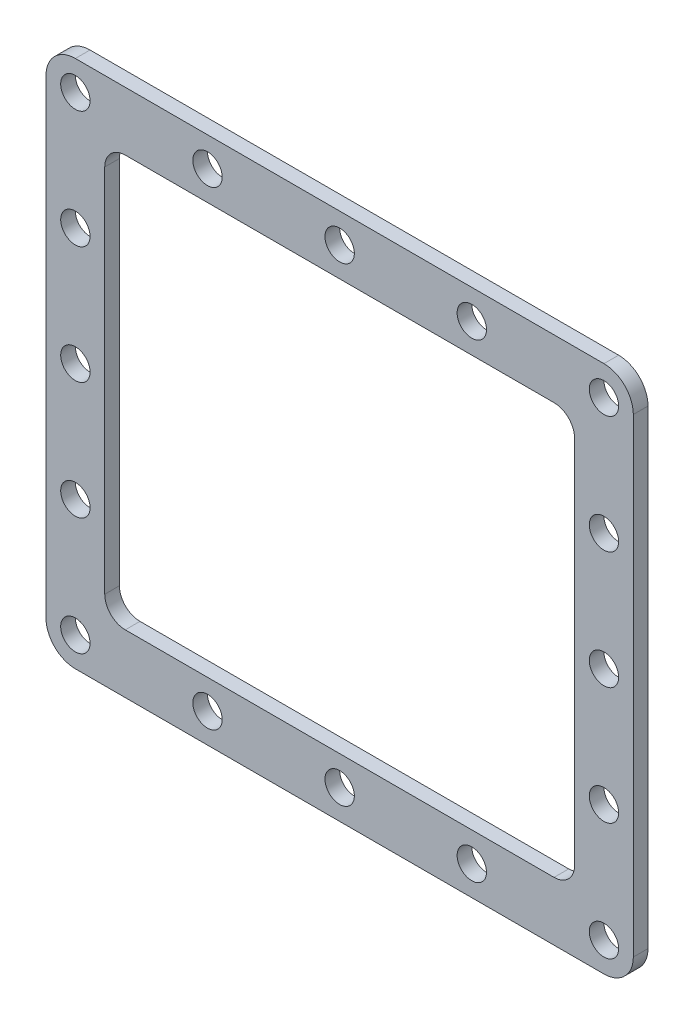
ISO-10303-21;
HEADER;
FILE_DESCRIPTION(('STEP AP214'),'2;1');
FILE_NAME('part.step','',(''),(''),'','','');
FILE_SCHEMA(('AUTOMOTIVE_DESIGN { 1 0 10303 214 1 1 1 1 }'));
ENDSEC;
DATA;
#1=APPLICATION_CONTEXT('core data for automotive mechanical design processes');
#2=APPLICATION_PROTOCOL_DEFINITION('international standard','automotive_design',2000,#1);
#3=PRODUCT_CONTEXT('',#1,'mechanical');
#4=PRODUCT('Part','Part','',(#3));
#5=PRODUCT_RELATED_PRODUCT_CATEGORY('part','',(#4));
#6=PRODUCT_DEFINITION_FORMATION('','',#4);
#7=PRODUCT_DEFINITION_CONTEXT('part definition',#1,'design');
#8=PRODUCT_DEFINITION('design','',#6,#7);
#9=PRODUCT_DEFINITION_SHAPE('','',#8);
#10=(LENGTH_UNIT() NAMED_UNIT(*) SI_UNIT(.MILLI.,.METRE.));
#11=(NAMED_UNIT(*) PLANE_ANGLE_UNIT() SI_UNIT($,.RADIAN.));
#12=(NAMED_UNIT(*) SI_UNIT($,.STERADIAN.) SOLID_ANGLE_UNIT());
#13=UNCERTAINTY_MEASURE_WITH_UNIT(LENGTH_MEASURE(1.E-05),#10,'distance_accuracy_value','');
#14=(GEOMETRIC_REPRESENTATION_CONTEXT(3) GLOBAL_UNCERTAINTY_ASSIGNED_CONTEXT((#13)) GLOBAL_UNIT_ASSIGNED_CONTEXT((#10,
#11,#12)) REPRESENTATION_CONTEXT('',''));
#15=CARTESIAN_POINT('',(0.,0.,0.));
#16=DIRECTION('',(0.,0.,1.));
#17=DIRECTION('',(1.,0.,0.));
#18=AXIS2_PLACEMENT_3D('',#15,#16,#17);
#19=CARTESIAN_POINT('',(90.,80.,5.));
#20=DIRECTION('',(0.,0.,-1.));
#21=DIRECTION('',(-1.,0.,0.));
#22=AXIS2_PLACEMENT_3D('',#19,#20,#21);
#23=PLANE('',#22);
#24=CARTESIAN_POINT('',(90.,80.,5.));
#25=DIRECTION('',(0.,0.,1.));
#26=DIRECTION('',(-1.,0.,0.));
#27=AXIS2_PLACEMENT_3D('',#24,#25,#26);
#28=CIRCLE('',#27,10.);
#29=CARTESIAN_POINT('',(100.,80.,5.));
#30=VERTEX_POINT('',#29);
#31=CARTESIAN_POINT('',(90.,90.,5.));
#32=VERTEX_POINT('',#31);
#33=EDGE_CURVE('E245',#30,#32,#28,.T.);
#34=ORIENTED_EDGE('',*,*,#33,.T.);
#35=DIRECTION('',(-1.,0.,0.));
#36=VECTOR('',#35,1.);
#37=CARTESIAN_POINT('',(-90.,90.,5.));
#38=LINE('',#37,#36);
#39=CARTESIAN_POINT('',(-90.,90.,5.));
#40=VERTEX_POINT('',#39);
#41=EDGE_CURVE('E249',#32,#40,#38,.T.);
#42=ORIENTED_EDGE('',*,*,#41,.T.);
#43=CARTESIAN_POINT('',(-90.,80.0000000000001,5.));
#44=DIRECTION('',(0.,0.,1.));
#45=DIRECTION('',(-1.,0.,0.));
#46=AXIS2_PLACEMENT_3D('',#43,#44,#45);
#47=CIRCLE('',#46,9.99999999999998);
#48=CARTESIAN_POINT('',(-99.9999999999999,80.0000000000001,5.));
#49=VERTEX_POINT('',#48);
#50=EDGE_CURVE('E253',#40,#49,#47,.T.);
#51=ORIENTED_EDGE('',*,*,#50,.T.);
#52=DIRECTION('',(0.,-1.,0.));
#53=VECTOR('',#52,1.);
#54=CARTESIAN_POINT('',(-100.,-80.,5.));
#55=LINE('',#54,#53);
#56=CARTESIAN_POINT('',(-100.,-80.,5.));
#57=VERTEX_POINT('',#56);
#58=EDGE_CURVE('E256',#49,#57,#55,.T.);
#59=ORIENTED_EDGE('',*,*,#58,.T.);
#60=CARTESIAN_POINT('',(-90.,-80.,5.));
#61=DIRECTION('',(0.,0.,1.));
#62=DIRECTION('',(-1.,0.,0.));
#63=AXIS2_PLACEMENT_3D('',#60,#61,#62);
#64=CIRCLE('',#63,9.99999999999998);
#65=CARTESIAN_POINT('',(-90.,-90.,5.));
#66=VERTEX_POINT('',#65);
#67=EDGE_CURVE('E259',#57,#66,#64,.T.);
#68=ORIENTED_EDGE('',*,*,#67,.T.);
#69=DIRECTION('',(1.,0.,0.));
#70=VECTOR('',#69,1.);
#71=CARTESIAN_POINT('',(-90.,-90.,5.));
#72=LINE('',#71,#70);
#73=CARTESIAN_POINT('',(90.,-90.,5.));
#74=VERTEX_POINT('',#73);
#75=EDGE_CURVE('E262',#66,#74,#72,.T.);
#76=ORIENTED_EDGE('',*,*,#75,.T.);
#77=CARTESIAN_POINT('',(90.,-80.,5.));
#78=DIRECTION('',(0.,0.,1.));
#79=DIRECTION('',(1.,0.,0.));
#80=AXIS2_PLACEMENT_3D('',#77,#78,#79);
#81=CIRCLE('',#80,9.99999999999999);
#82=CARTESIAN_POINT('',(100.,-80.,5.));
#83=VERTEX_POINT('',#82);
#84=EDGE_CURVE('E265',#74,#83,#81,.T.);
#85=ORIENTED_EDGE('',*,*,#84,.T.);
#86=DIRECTION('',(0.,1.,0.));
#87=VECTOR('',#86,1.);
#88=CARTESIAN_POINT('',(100.,-80.,5.));
#89=LINE('',#88,#87);
#90=EDGE_CURVE('E268',#83,#30,#89,.T.);
#91=ORIENTED_EDGE('',*,*,#90,.T.);
#92=EDGE_LOOP('',(#34,#42,#51,#59,#68,#76,#85,#91));
#93=FACE_BOUND('',#92,.T.);
#94=CARTESIAN_POINT('',(73.0000000000001,63.,5.));
#95=DIRECTION('',(0.,0.,1.));
#96=DIRECTION('',(-1.,0.,0.));
#97=AXIS2_PLACEMENT_3D('',#94,#95,#96);
#98=CIRCLE('',#97,7.00000000000001);
#99=CARTESIAN_POINT('',(80.0000000000001,63.,5.));
#100=VERTEX_POINT('',#99);
#101=CARTESIAN_POINT('',(73.0000000000001,70.,5.));
#102=VERTEX_POINT('',#101);
#103=EDGE_CURVE('E153',#100,#102,#98,.T.);
#104=ORIENTED_EDGE('',*,*,#103,.F.);
#105=DIRECTION('',(0.,1.,0.));
#106=VECTOR('',#105,1.);
#107=CARTESIAN_POINT('',(80.0000000000001,-63.,5.));
#108=LINE('',#107,#106);
#109=CARTESIAN_POINT('',(80.0000000000001,-63.,5.));
#110=VERTEX_POINT('',#109);
#111=EDGE_CURVE('E196',#110,#100,#108,.T.);
#112=ORIENTED_EDGE('',*,*,#111,.F.);
#113=CARTESIAN_POINT('',(73.0000000000001,-63.,5.));
#114=DIRECTION('',(0.,0.,1.));
#115=DIRECTION('',(1.,0.,0.));
#116=AXIS2_PLACEMENT_3D('',#113,#114,#115);
#117=CIRCLE('',#116,7.);
#118=CARTESIAN_POINT('',(73.0000000000001,-70.,5.));
#119=VERTEX_POINT('',#118);
#120=EDGE_CURVE('E193',#119,#110,#117,.T.);
#121=ORIENTED_EDGE('',*,*,#120,.F.);
#122=DIRECTION('',(1.,0.,0.));
#123=VECTOR('',#122,1.);
#124=CARTESIAN_POINT('',(-73.,-70.,5.));
#125=LINE('',#124,#123);
#126=CARTESIAN_POINT('',(-73.,-70.,5.));
#127=VERTEX_POINT('',#126);
#128=EDGE_CURVE('E190',#127,#119,#125,.T.);
#129=ORIENTED_EDGE('',*,*,#128,.F.);
#130=CARTESIAN_POINT('',(-73.,-63.,5.));
#131=DIRECTION('',(0.,0.,1.));
#132=DIRECTION('',(-1.,0.,0.));
#133=AXIS2_PLACEMENT_3D('',#130,#131,#132);
#134=CIRCLE('',#133,7.);
#135=CARTESIAN_POINT('',(-80.,-63.,5.));
#136=VERTEX_POINT('',#135);
#137=EDGE_CURVE('E187',#136,#127,#134,.T.);
#138=ORIENTED_EDGE('',*,*,#137,.F.);
#139=DIRECTION('',(0.,-1.,0.));
#140=VECTOR('',#139,1.);
#141=CARTESIAN_POINT('',(-80.,-63.,5.));
#142=LINE('',#141,#140);
#143=CARTESIAN_POINT('',(-80.,63.,5.));
#144=VERTEX_POINT('',#143);
#145=EDGE_CURVE('E181',#144,#136,#142,.T.);
#146=ORIENTED_EDGE('',*,*,#145,.F.);
#147=CARTESIAN_POINT('',(-73.,63.,5.));
#148=DIRECTION('',(0.,0.,1.));
#149=DIRECTION('',(-1.,0.,0.));
#150=AXIS2_PLACEMENT_3D('',#147,#148,#149);
#151=CIRCLE('',#150,7.00000000000001);
#152=CARTESIAN_POINT('',(-73.,70.,5.));
#153=VERTEX_POINT('',#152);
#154=EDGE_CURVE('E177',#153,#144,#151,.T.);
#155=ORIENTED_EDGE('',*,*,#154,.F.);
#156=DIRECTION('',(-1.,0.,0.));
#157=VECTOR('',#156,1.);
#158=CARTESIAN_POINT('',(-73.,70.,5.));
#159=LINE('',#158,#157);
#160=EDGE_CURVE('E162',#102,#153,#159,.T.);
#161=ORIENTED_EDGE('',*,*,#160,.F.);
#162=EDGE_LOOP('',(#104,#112,#121,#129,#138,#146,#155,#161));
#163=FACE_BOUND('',#162,.T.);
#164=CARTESIAN_POINT('',(90.,-80.,5.));
#165=DIRECTION('',(0.,0.,1.));
#166=DIRECTION('',(1.,0.,0.));
#167=AXIS2_PLACEMENT_3D('',#164,#165,#166);
#168=CIRCLE('',#167,5.00000000000001);
#169=CARTESIAN_POINT('',(95.,-80.,5.));
#170=VERTEX_POINT('',#169);
#171=EDGE_CURVE('E201',#170,#170,#168,.T.);
#172=ORIENTED_EDGE('',*,*,#171,.F.);
#173=EDGE_LOOP('',(#172));
#174=FACE_BOUND('',#173,.T.);
#175=CARTESIAN_POINT('',(90.,80.,5.));
#176=DIRECTION('',(0.,0.,1.));
#177=DIRECTION('',(1.,0.,0.));
#178=AXIS2_PLACEMENT_3D('',#175,#176,#177);
#179=CIRCLE('',#178,5.00000000000001);
#180=CARTESIAN_POINT('',(95.,80.,5.));
#181=VERTEX_POINT('',#180);
#182=EDGE_CURVE('E594',#181,#181,#179,.T.);
#183=ORIENTED_EDGE('',*,*,#182,.F.);
#184=EDGE_LOOP('',(#183));
#185=FACE_BOUND('',#184,.T.);
#186=CARTESIAN_POINT('',(-90.,80.0000000000001,5.));
#187=DIRECTION('',(0.,0.,1.));
#188=DIRECTION('',(1.,0.,0.));
#189=AXIS2_PLACEMENT_3D('',#186,#187,#188);
#190=CIRCLE('',#189,4.99999999999997);
#191=CARTESIAN_POINT('',(-85.,80.0000000000001,5.));
#192=VERTEX_POINT('',#191);
#193=EDGE_CURVE('E586',#192,#192,#190,.T.);
#194=ORIENTED_EDGE('',*,*,#193,.F.);
#195=EDGE_LOOP('',(#194));
#196=FACE_BOUND('',#195,.T.);
#197=CARTESIAN_POINT('',(-90.,-80.,5.));
#198=DIRECTION('',(0.,0.,1.));
#199=DIRECTION('',(1.,0.,0.));
#200=AXIS2_PLACEMENT_3D('',#197,#198,#199);
#201=CIRCLE('',#200,5.);
#202=CARTESIAN_POINT('',(-85.,-80.,5.));
#203=VERTEX_POINT('',#202);
#204=EDGE_CURVE('E578',#203,#203,#201,.T.);
#205=ORIENTED_EDGE('',*,*,#204,.F.);
#206=EDGE_LOOP('',(#205));
#207=FACE_BOUND('',#206,.T.);
#208=CARTESIAN_POINT('',(90.,0.,5.));
#209=DIRECTION('',(0.,0.,1.));
#210=DIRECTION('',(1.,0.,0.));
#211=AXIS2_PLACEMENT_3D('',#208,#209,#210);
#212=CIRCLE('',#211,5.00000000000002);
#213=CARTESIAN_POINT('',(95.0000000000001,0.,5.));
#214=VERTEX_POINT('',#213);
#215=EDGE_CURVE('E570',#214,#214,#212,.T.);
#216=ORIENTED_EDGE('',*,*,#215,.F.);
#217=EDGE_LOOP('',(#216));
#218=FACE_BOUND('',#217,.T.);
#219=CARTESIAN_POINT('',(90.,-40.,5.));
#220=DIRECTION('',(0.,0.,1.));
#221=DIRECTION('',(1.,0.,0.));
#222=AXIS2_PLACEMENT_3D('',#219,#220,#221);
#223=CIRCLE('',#222,5.);
#224=CARTESIAN_POINT('',(95.,-40.,5.));
#225=VERTEX_POINT('',#224);
#226=EDGE_CURVE('E562',#225,#225,#223,.T.);
#227=ORIENTED_EDGE('',*,*,#226,.F.);
#228=EDGE_LOOP('',(#227));
#229=FACE_BOUND('',#228,.T.);
#230=CARTESIAN_POINT('',(90.,40.,5.));
#231=DIRECTION('',(0.,0.,1.));
#232=DIRECTION('',(1.,0.,0.));
#233=AXIS2_PLACEMENT_3D('',#230,#231,#232);
#234=CIRCLE('',#233,4.99999999999999);
#235=CARTESIAN_POINT('',(95.,40.,5.));
#236=VERTEX_POINT('',#235);
#237=EDGE_CURVE('E554',#236,#236,#234,.T.);
#238=ORIENTED_EDGE('',*,*,#237,.F.);
#239=EDGE_LOOP('',(#238));
#240=FACE_BOUND('',#239,.T.);
#241=CARTESIAN_POINT('',(-89.9999999999999,-40.,5.));
#242=DIRECTION('',(0.,0.,1.));
#243=DIRECTION('',(-1.,0.,0.));
#244=AXIS2_PLACEMENT_3D('',#241,#242,#243);
#245=CIRCLE('',#244,4.9999999999999);
#246=CARTESIAN_POINT('',(-94.9999999999998,-40.,5.));
#247=VERTEX_POINT('',#246);
#248=EDGE_CURVE('E546',#247,#247,#245,.T.);
#249=ORIENTED_EDGE('',*,*,#248,.F.);
#250=EDGE_LOOP('',(#249));
#251=FACE_BOUND('',#250,.T.);
#252=CARTESIAN_POINT('',(-89.9999999999999,0.,5.));
#253=DIRECTION('',(0.,0.,1.));
#254=DIRECTION('',(-1.,0.,0.));
#255=AXIS2_PLACEMENT_3D('',#252,#253,#254);
#256=CIRCLE('',#255,4.99999999999988);
#257=CARTESIAN_POINT('',(-94.9999999999998,0.,5.));
#258=VERTEX_POINT('',#257);
#259=EDGE_CURVE('E538',#258,#258,#256,.T.);
#260=ORIENTED_EDGE('',*,*,#259,.F.);
#261=EDGE_LOOP('',(#260));
#262=FACE_BOUND('',#261,.T.);
#263=CARTESIAN_POINT('',(-89.9999999999999,40.,5.));
#264=DIRECTION('',(0.,0.,1.));
#265=DIRECTION('',(-1.,0.,0.));
#266=AXIS2_PLACEMENT_3D('',#263,#264,#265);
#267=CIRCLE('',#266,4.99999999999988);
#268=CARTESIAN_POINT('',(-94.9999999999998,40.,5.));
#269=VERTEX_POINT('',#268);
#270=EDGE_CURVE('E530',#269,#269,#267,.T.);
#271=ORIENTED_EDGE('',*,*,#270,.F.);
#272=EDGE_LOOP('',(#271));
#273=FACE_BOUND('',#272,.T.);
#274=CARTESIAN_POINT('',(0.,80.,5.));
#275=DIRECTION('',(0.,0.,1.));
#276=DIRECTION('',(1.,0.,0.));
#277=AXIS2_PLACEMENT_3D('',#274,#275,#276);
#278=CIRCLE('',#277,5.);
#279=CARTESIAN_POINT('',(5.00000000000003,80.,5.));
#280=VERTEX_POINT('',#279);
#281=EDGE_CURVE('E522',#280,#280,#278,.T.);
#282=ORIENTED_EDGE('',*,*,#281,.F.);
#283=EDGE_LOOP('',(#282));
#284=FACE_BOUND('',#283,.T.);
#285=CARTESIAN_POINT('',(-45.,80.,5.));
#286=DIRECTION('',(0.,0.,1.));
#287=DIRECTION('',(1.,0.,0.));
#288=AXIS2_PLACEMENT_3D('',#285,#286,#287);
#289=CIRCLE('',#288,4.99999999999999);
#290=CARTESIAN_POINT('',(-40.,80.,5.));
#291=VERTEX_POINT('',#290);
#292=EDGE_CURVE('E514',#291,#291,#289,.T.);
#293=ORIENTED_EDGE('',*,*,#292,.F.);
#294=EDGE_LOOP('',(#293));
#295=FACE_BOUND('',#294,.T.);
#296=CARTESIAN_POINT('',(45.,80.,5.));
#297=DIRECTION('',(0.,0.,1.));
#298=DIRECTION('',(1.,0.,0.));
#299=AXIS2_PLACEMENT_3D('',#296,#297,#298);
#300=CIRCLE('',#299,5.);
#301=CARTESIAN_POINT('',(50.,80.,5.));
#302=VERTEX_POINT('',#301);
#303=EDGE_CURVE('E506',#302,#302,#300,.T.);
#304=ORIENTED_EDGE('',*,*,#303,.F.);
#305=EDGE_LOOP('',(#304));
#306=FACE_BOUND('',#305,.T.);
#307=CARTESIAN_POINT('',(0.,-80.,5.));
#308=DIRECTION('',(0.,0.,1.));
#309=DIRECTION('',(1.,0.,0.));
#310=AXIS2_PLACEMENT_3D('',#307,#308,#309);
#311=CIRCLE('',#310,5.);
#312=CARTESIAN_POINT('',(5.00000000000003,-80.,5.));
#313=VERTEX_POINT('',#312);
#314=EDGE_CURVE('E498',#313,#313,#311,.T.);
#315=ORIENTED_EDGE('',*,*,#314,.F.);
#316=EDGE_LOOP('',(#315));
#317=FACE_BOUND('',#316,.T.);
#318=CARTESIAN_POINT('',(-45.,-80.,5.));
#319=DIRECTION('',(0.,0.,1.));
#320=DIRECTION('',(1.,0.,0.));
#321=AXIS2_PLACEMENT_3D('',#318,#319,#320);
#322=CIRCLE('',#321,4.99999999999999);
#323=CARTESIAN_POINT('',(-40.,-80.,5.));
#324=VERTEX_POINT('',#323);
#325=EDGE_CURVE('E490',#324,#324,#322,.T.);
#326=ORIENTED_EDGE('',*,*,#325,.F.);
#327=EDGE_LOOP('',(#326));
#328=FACE_BOUND('',#327,.T.);
#329=CARTESIAN_POINT('',(45.,-80.,5.));
#330=DIRECTION('',(0.,0.,1.));
#331=DIRECTION('',(1.,0.,0.));
#332=AXIS2_PLACEMENT_3D('',#329,#330,#331);
#333=CIRCLE('',#332,5.);
#334=CARTESIAN_POINT('',(50.,-80.,5.));
#335=VERTEX_POINT('',#334);
#336=EDGE_CURVE('E479',#335,#335,#333,.T.);
#337=ORIENTED_EDGE('',*,*,#336,.F.);
#338=EDGE_LOOP('',(#337));
#339=FACE_BOUND('',#338,.T.);
#340=ADVANCED_FACE('F39',(#93,#163,#174,#185,#196,#207,#218,#229,#240,#251,#262,#273,#284,#295,
#306,#317,#328,#339),#23,.F.);
#341=CARTESIAN_POINT('',(90.,80.,0.));
#342=DIRECTION('',(0.,0.,-1.));
#343=DIRECTION('',(-1.,0.,0.));
#344=AXIS2_PLACEMENT_3D('',#341,#342,#343);
#345=PLANE('',#344);
#346=CARTESIAN_POINT('',(-45.,-80.,0.));
#347=DIRECTION('',(0.,0.,1.));
#348=DIRECTION('',(1.,0.,0.));
#349=AXIS2_PLACEMENT_3D('',#346,#347,#348);
#350=CIRCLE('',#349,4.99999999999999);
#351=CARTESIAN_POINT('',(-40.,-80.,0.));
#352=VERTEX_POINT('',#351);
#353=EDGE_CURVE('E487',#352,#352,#350,.T.);
#354=ORIENTED_EDGE('',*,*,#353,.T.);
#355=EDGE_LOOP('',(#354));
#356=FACE_BOUND('',#355,.T.);
#357=CARTESIAN_POINT('',(45.,80.,0.));
#358=DIRECTION('',(0.,0.,1.));
#359=DIRECTION('',(1.,0.,0.));
#360=AXIS2_PLACEMENT_3D('',#357,#358,#359);
#361=CIRCLE('',#360,5.);
#362=CARTESIAN_POINT('',(50.,80.,0.));
#363=VERTEX_POINT('',#362);
#364=EDGE_CURVE('E502',#363,#363,#361,.T.);
#365=ORIENTED_EDGE('',*,*,#364,.T.);
#366=EDGE_LOOP('',(#365));
#367=FACE_BOUND('',#366,.T.);
#368=CARTESIAN_POINT('',(0.,80.,0.));
#369=DIRECTION('',(0.,0.,1.));
#370=DIRECTION('',(1.,0.,0.));
#371=AXIS2_PLACEMENT_3D('',#368,#369,#370);
#372=CIRCLE('',#371,5.);
#373=CARTESIAN_POINT('',(5.00000000000003,80.,0.));
#374=VERTEX_POINT('',#373);
#375=EDGE_CURVE('E518',#374,#374,#372,.T.);
#376=ORIENTED_EDGE('',*,*,#375,.T.);
#377=EDGE_LOOP('',(#376));
#378=FACE_BOUND('',#377,.T.);
#379=CARTESIAN_POINT('',(-89.9999999999999,0.,0.));
#380=DIRECTION('',(0.,0.,1.));
#381=DIRECTION('',(-1.,0.,0.));
#382=AXIS2_PLACEMENT_3D('',#379,#380,#381);
#383=CIRCLE('',#382,4.99999999999988);
#384=CARTESIAN_POINT('',(-94.9999999999998,0.,0.));
#385=VERTEX_POINT('',#384);
#386=EDGE_CURVE('E534',#385,#385,#383,.T.);
#387=ORIENTED_EDGE('',*,*,#386,.T.);
#388=EDGE_LOOP('',(#387));
#389=FACE_BOUND('',#388,.T.);
#390=CARTESIAN_POINT('',(90.,40.,0.));
#391=DIRECTION('',(0.,0.,1.));
#392=DIRECTION('',(1.,0.,0.));
#393=AXIS2_PLACEMENT_3D('',#390,#391,#392);
#394=CIRCLE('',#393,4.99999999999999);
#395=CARTESIAN_POINT('',(95.,40.,0.));
#396=VERTEX_POINT('',#395);
#397=EDGE_CURVE('E550',#396,#396,#394,.T.);
#398=ORIENTED_EDGE('',*,*,#397,.T.);
#399=EDGE_LOOP('',(#398));
#400=FACE_BOUND('',#399,.T.);
#401=CARTESIAN_POINT('',(90.,0.,0.));
#402=DIRECTION('',(0.,0.,1.));
#403=DIRECTION('',(1.,0.,0.));
#404=AXIS2_PLACEMENT_3D('',#401,#402,#403);
#405=CIRCLE('',#404,5.00000000000002);
#406=CARTESIAN_POINT('',(95.0000000000001,0.,0.));
#407=VERTEX_POINT('',#406);
#408=EDGE_CURVE('E566',#407,#407,#405,.T.);
#409=ORIENTED_EDGE('',*,*,#408,.T.);
#410=EDGE_LOOP('',(#409));
#411=FACE_BOUND('',#410,.T.);
#412=CARTESIAN_POINT('',(-90.,80.0000000000001,0.));
#413=DIRECTION('',(0.,0.,1.));
#414=DIRECTION('',(1.,0.,0.));
#415=AXIS2_PLACEMENT_3D('',#412,#413,#414);
#416=CIRCLE('',#415,4.99999999999997);
#417=CARTESIAN_POINT('',(-85.,80.0000000000001,0.));
#418=VERTEX_POINT('',#417);
#419=EDGE_CURVE('E582',#418,#418,#416,.T.);
#420=ORIENTED_EDGE('',*,*,#419,.T.);
#421=EDGE_LOOP('',(#420));
#422=FACE_BOUND('',#421,.T.);
#423=CARTESIAN_POINT('',(90.,-80.,0.));
#424=DIRECTION('',(0.,0.,1.));
#425=DIRECTION('',(1.,0.,0.));
#426=AXIS2_PLACEMENT_3D('',#423,#424,#425);
#427=CIRCLE('',#426,5.00000000000001);
#428=CARTESIAN_POINT('',(95.,-80.,0.));
#429=VERTEX_POINT('',#428);
#430=EDGE_CURVE('E598',#429,#429,#427,.T.);
#431=ORIENTED_EDGE('',*,*,#430,.T.);
#432=EDGE_LOOP('',(#431));
#433=FACE_BOUND('',#432,.T.);
#434=CARTESIAN_POINT('',(90.,80.,0.));
#435=DIRECTION('',(0.,0.,1.));
#436=DIRECTION('',(-1.,0.,0.));
#437=AXIS2_PLACEMENT_3D('',#434,#435,#436);
#438=CIRCLE('',#437,10.);
#439=CARTESIAN_POINT('',(100.,80.,0.));
#440=VERTEX_POINT('',#439);
#441=CARTESIAN_POINT('',(90.,90.,0.));
#442=VERTEX_POINT('',#441);
#443=EDGE_CURVE('E171',#440,#442,#438,.T.);
#444=ORIENTED_EDGE('',*,*,#443,.F.);
#445=DIRECTION('',(0.,1.,0.));
#446=VECTOR('',#445,1.);
#447=CARTESIAN_POINT('',(100.,-80.,0.));
#448=LINE('',#447,#446);
#449=CARTESIAN_POINT('',(100.,-80.,0.));
#450=VERTEX_POINT('',#449);
#451=EDGE_CURVE('E250',#450,#440,#448,.T.);
#452=ORIENTED_EDGE('',*,*,#451,.F.);
#453=CARTESIAN_POINT('',(90.,-80.,0.));
#454=DIRECTION('',(0.,0.,1.));
#455=DIRECTION('',(1.,0.,0.));
#456=AXIS2_PLACEMENT_3D('',#453,#454,#455);
#457=CIRCLE('',#456,9.99999999999999);
#458=CARTESIAN_POINT('',(90.,-90.,0.));
#459=VERTEX_POINT('',#458);
#460=EDGE_CURVE('E290',#459,#450,#457,.T.);
#461=ORIENTED_EDGE('',*,*,#460,.F.);
#462=DIRECTION('',(1.,0.,0.));
#463=VECTOR('',#462,1.);
#464=CARTESIAN_POINT('',(-90.,-90.,0.));
#465=LINE('',#464,#463);
#466=CARTESIAN_POINT('',(-90.,-90.,0.));
#467=VERTEX_POINT('',#466);
#468=EDGE_CURVE('E287',#467,#459,#465,.T.);
#469=ORIENTED_EDGE('',*,*,#468,.F.);
#470=CARTESIAN_POINT('',(-90.,-80.,0.));
#471=DIRECTION('',(0.,0.,1.));
#472=DIRECTION('',(-1.,0.,0.));
#473=AXIS2_PLACEMENT_3D('',#470,#471,#472);
#474=CIRCLE('',#473,9.99999999999998);
#475=CARTESIAN_POINT('',(-100.,-80.,0.));
#476=VERTEX_POINT('',#475);
#477=EDGE_CURVE('E284',#476,#467,#474,.T.);
#478=ORIENTED_EDGE('',*,*,#477,.F.);
#479=DIRECTION('',(0.,-1.,0.));
#480=VECTOR('',#479,1.);
#481=CARTESIAN_POINT('',(-100.,-80.,0.));
#482=LINE('',#481,#480);
#483=CARTESIAN_POINT('',(-99.9999999999999,80.0000000000001,0.));
#484=VERTEX_POINT('',#483);
#485=EDGE_CURVE('E281',#484,#476,#482,.T.);
#486=ORIENTED_EDGE('',*,*,#485,.F.);
#487=CARTESIAN_POINT('',(-90.,80.0000000000001,0.));
#488=DIRECTION('',(0.,0.,1.));
#489=DIRECTION('',(-1.,0.,0.));
#490=AXIS2_PLACEMENT_3D('',#487,#488,#489);
#491=CIRCLE('',#490,9.99999999999998);
#492=CARTESIAN_POINT('',(-90.,90.,0.));
#493=VERTEX_POINT('',#492);
#494=EDGE_CURVE('E278',#493,#484,#491,.T.);
#495=ORIENTED_EDGE('',*,*,#494,.F.);
#496=DIRECTION('',(-1.,0.,0.));
#497=VECTOR('',#496,1.);
#498=CARTESIAN_POINT('',(-90.,90.,0.));
#499=LINE('',#498,#497);
#500=EDGE_CURVE('E275',#442,#493,#499,.T.);
#501=ORIENTED_EDGE('',*,*,#500,.F.);
#502=EDGE_LOOP('',(#444,#452,#461,#469,#478,#486,#495,#501));
#503=FACE_BOUND('',#502,.T.);
#504=DIRECTION('',(0.,1.,0.));
#505=VECTOR('',#504,1.);
#506=CARTESIAN_POINT('',(80.0000000000001,-63.,0.));
#507=LINE('',#506,#505);
#508=CARTESIAN_POINT('',(80.0000000000001,-63.,0.));
#509=VERTEX_POINT('',#508);
#510=CARTESIAN_POINT('',(80.0000000000001,63.,0.));
#511=VERTEX_POINT('',#510);
#512=EDGE_CURVE('E163',#509,#511,#507,.T.);
#513=ORIENTED_EDGE('',*,*,#512,.T.);
#514=CARTESIAN_POINT('',(73.0000000000001,63.,0.));
#515=DIRECTION('',(0.,0.,1.));
#516=DIRECTION('',(-1.,0.,0.));
#517=AXIS2_PLACEMENT_3D('',#514,#515,#516);
#518=CIRCLE('',#517,7.00000000000001);
#519=CARTESIAN_POINT('',(73.0000000000001,70.,0.));
#520=VERTEX_POINT('',#519);
#521=EDGE_CURVE('E63',#511,#520,#518,.T.);
#522=ORIENTED_EDGE('',*,*,#521,.T.);
#523=DIRECTION('',(-1.,0.,0.));
#524=VECTOR('',#523,1.);
#525=CARTESIAN_POINT('',(-73.,70.,0.));
#526=LINE('',#525,#524);
#527=CARTESIAN_POINT('',(-73.,70.,0.));
#528=VERTEX_POINT('',#527);
#529=EDGE_CURVE('E169',#520,#528,#526,.T.);
#530=ORIENTED_EDGE('',*,*,#529,.T.);
#531=CARTESIAN_POINT('',(-73.,63.,0.));
#532=DIRECTION('',(0.,0.,1.));
#533=DIRECTION('',(-1.,0.,0.));
#534=AXIS2_PLACEMENT_3D('',#531,#532,#533);
#535=CIRCLE('',#534,7.00000000000001);
#536=CARTESIAN_POINT('',(-80.,63.,0.));
#537=VERTEX_POINT('',#536);
#538=EDGE_CURVE('E204',#528,#537,#535,.T.);
#539=ORIENTED_EDGE('',*,*,#538,.T.);
#540=DIRECTION('',(0.,-1.,0.));
#541=VECTOR('',#540,1.);
#542=CARTESIAN_POINT('',(-80.,-63.,0.));
#543=LINE('',#542,#541);
#544=CARTESIAN_POINT('',(-80.,-63.,0.));
#545=VERTEX_POINT('',#544);
#546=EDGE_CURVE('E208',#537,#545,#543,.T.);
#547=ORIENTED_EDGE('',*,*,#546,.T.);
#548=CARTESIAN_POINT('',(-73.,-63.,0.));
#549=DIRECTION('',(0.,0.,1.));
#550=DIRECTION('',(-1.,0.,0.));
#551=AXIS2_PLACEMENT_3D('',#548,#549,#550);
#552=CIRCLE('',#551,7.);
#553=CARTESIAN_POINT('',(-73.,-70.,0.));
#554=VERTEX_POINT('',#553);
#555=EDGE_CURVE('E212',#545,#554,#552,.T.);
#556=ORIENTED_EDGE('',*,*,#555,.T.);
#557=DIRECTION('',(1.,0.,0.));
#558=VECTOR('',#557,1.);
#559=CARTESIAN_POINT('',(-73.,-70.,0.));
#560=LINE('',#559,#558);
#561=CARTESIAN_POINT('',(73.0000000000001,-70.,0.));
#562=VERTEX_POINT('',#561);
#563=EDGE_CURVE('E216',#554,#562,#560,.T.);
#564=ORIENTED_EDGE('',*,*,#563,.T.);
#565=CARTESIAN_POINT('',(73.0000000000001,-63.,0.));
#566=DIRECTION('',(0.,0.,1.));
#567=DIRECTION('',(1.,0.,0.));
#568=AXIS2_PLACEMENT_3D('',#565,#566,#567);
#569=CIRCLE('',#568,7.);
#570=EDGE_CURVE('E220',#562,#509,#569,.T.);
#571=ORIENTED_EDGE('',*,*,#570,.T.);
#572=EDGE_LOOP('',(#513,#522,#530,#539,#547,#556,#564,#571));
#573=FACE_BOUND('',#572,.T.);
#574=CARTESIAN_POINT('',(90.,80.,0.));
#575=DIRECTION('',(0.,0.,1.));
#576=DIRECTION('',(1.,0.,0.));
#577=AXIS2_PLACEMENT_3D('',#574,#575,#576);
#578=CIRCLE('',#577,5.00000000000001);
#579=CARTESIAN_POINT('',(95.,80.,0.));
#580=VERTEX_POINT('',#579);
#581=EDGE_CURVE('E590',#580,#580,#578,.T.);
#582=ORIENTED_EDGE('',*,*,#581,.T.);
#583=EDGE_LOOP('',(#582));
#584=FACE_BOUND('',#583,.T.);
#585=CARTESIAN_POINT('',(-90.,-80.,0.));
#586=DIRECTION('',(0.,0.,1.));
#587=DIRECTION('',(1.,0.,0.));
#588=AXIS2_PLACEMENT_3D('',#585,#586,#587);
#589=CIRCLE('',#588,5.);
#590=CARTESIAN_POINT('',(-85.,-80.,0.));
#591=VERTEX_POINT('',#590);
#592=EDGE_CURVE('E574',#591,#591,#589,.T.);
#593=ORIENTED_EDGE('',*,*,#592,.T.);
#594=EDGE_LOOP('',(#593));
#595=FACE_BOUND('',#594,.T.);
#596=CARTESIAN_POINT('',(90.,-40.,0.));
#597=DIRECTION('',(0.,0.,1.));
#598=DIRECTION('',(1.,0.,0.));
#599=AXIS2_PLACEMENT_3D('',#596,#597,#598);
#600=CIRCLE('',#599,5.);
#601=CARTESIAN_POINT('',(95.,-40.,0.));
#602=VERTEX_POINT('',#601);
#603=EDGE_CURVE('E558',#602,#602,#600,.T.);
#604=ORIENTED_EDGE('',*,*,#603,.T.);
#605=EDGE_LOOP('',(#604));
#606=FACE_BOUND('',#605,.T.);
#607=CARTESIAN_POINT('',(-89.9999999999999,-40.,0.));
#608=DIRECTION('',(0.,0.,1.));
#609=DIRECTION('',(-1.,0.,0.));
#610=AXIS2_PLACEMENT_3D('',#607,#608,#609);
#611=CIRCLE('',#610,4.9999999999999);
#612=CARTESIAN_POINT('',(-94.9999999999998,-40.,0.));
#613=VERTEX_POINT('',#612);
#614=EDGE_CURVE('E542',#613,#613,#611,.T.);
#615=ORIENTED_EDGE('',*,*,#614,.T.);
#616=EDGE_LOOP('',(#615));
#617=FACE_BOUND('',#616,.T.);
#618=CARTESIAN_POINT('',(-89.9999999999999,40.,0.));
#619=DIRECTION('',(0.,0.,1.));
#620=DIRECTION('',(-1.,0.,0.));
#621=AXIS2_PLACEMENT_3D('',#618,#619,#620);
#622=CIRCLE('',#621,4.99999999999988);
#623=CARTESIAN_POINT('',(-94.9999999999998,40.,0.));
#624=VERTEX_POINT('',#623);
#625=EDGE_CURVE('E526',#624,#624,#622,.T.);
#626=ORIENTED_EDGE('',*,*,#625,.T.);
#627=EDGE_LOOP('',(#626));
#628=FACE_BOUND('',#627,.T.);
#629=CARTESIAN_POINT('',(-45.,80.,0.));
#630=DIRECTION('',(0.,0.,1.));
#631=DIRECTION('',(1.,0.,0.));
#632=AXIS2_PLACEMENT_3D('',#629,#630,#631);
#633=CIRCLE('',#632,4.99999999999999);
#634=CARTESIAN_POINT('',(-40.,80.,0.));
#635=VERTEX_POINT('',#634);
#636=EDGE_CURVE('E510',#635,#635,#633,.T.);
#637=ORIENTED_EDGE('',*,*,#636,.T.);
#638=EDGE_LOOP('',(#637));
#639=FACE_BOUND('',#638,.T.);
#640=CARTESIAN_POINT('',(0.,-80.,0.));
#641=DIRECTION('',(0.,0.,1.));
#642=DIRECTION('',(1.,0.,0.));
#643=AXIS2_PLACEMENT_3D('',#640,#641,#642);
#644=CIRCLE('',#643,5.);
#645=CARTESIAN_POINT('',(5.00000000000003,-80.,0.));
#646=VERTEX_POINT('',#645);
#647=EDGE_CURVE('E494',#646,#646,#644,.T.);
#648=ORIENTED_EDGE('',*,*,#647,.T.);
#649=EDGE_LOOP('',(#648));
#650=FACE_BOUND('',#649,.T.);
#651=CARTESIAN_POINT('',(45.,-80.,0.));
#652=DIRECTION('',(0.,0.,1.));
#653=DIRECTION('',(1.,0.,0.));
#654=AXIS2_PLACEMENT_3D('',#651,#652,#653);
#655=CIRCLE('',#654,5.);
#656=CARTESIAN_POINT('',(50.,-80.,0.));
#657=VERTEX_POINT('',#656);
#658=EDGE_CURVE('E482',#657,#657,#655,.T.);
#659=ORIENTED_EDGE('',*,*,#658,.T.);
#660=EDGE_LOOP('',(#659));
#661=FACE_BOUND('',#660,.T.);
#662=ADVANCED_FACE('F329',(#356,#367,#378,#389,#400,#411,#422,#433,#503,#573,#584,#595,#606,
#617,#628,#639,#650,#661),#345,.T.);
#663=CARTESIAN_POINT('',(90.,80.,5.));
#664=DIRECTION('',(0.,0.,-1.));
#665=DIRECTION('',(-1.,0.,0.));
#666=AXIS2_PLACEMENT_3D('',#663,#664,#665);
#667=CYLINDRICAL_SURFACE('',#666,10.);
#668=ORIENTED_EDGE('',*,*,#443,.T.);
#669=DIRECTION('',(0.,0.,-1.));
#670=VECTOR('',#669,1.);
#671=CARTESIAN_POINT('',(90.,90.,5.));
#672=LINE('',#671,#670);
#673=EDGE_CURVE('E11',#32,#442,#672,.T.);
#674=ORIENTED_EDGE('',*,*,#673,.F.);
#675=ORIENTED_EDGE('',*,*,#33,.F.);
#676=DIRECTION('',(0.,0.,-1.));
#677=VECTOR('',#676,1.);
#678=CARTESIAN_POINT('',(100.,80.,5.));
#679=LINE('',#678,#677);
#680=EDGE_CURVE('E271',#30,#440,#679,.T.);
#681=ORIENTED_EDGE('',*,*,#680,.T.);
#682=EDGE_LOOP('',(#668,#674,#675,#681));
#683=FACE_BOUND('',#682,.T.);
#684=ADVANCED_FACE('F41',(#683),#667,.T.);
#685=CARTESIAN_POINT('',(-90.,90.,5.));
#686=DIRECTION('',(0.,-1.,0.));
#687=DIRECTION('',(0.,0.,-1.));
#688=AXIS2_PLACEMENT_3D('',#685,#686,#687);
#689=PLANE('',#688);
#690=ORIENTED_EDGE('',*,*,#500,.T.);
#691=DIRECTION('',(0.,0.,-1.));
#692=VECTOR('',#691,1.);
#693=CARTESIAN_POINT('',(-90.,90.,5.));
#694=LINE('',#693,#692);
#695=EDGE_CURVE('E48',#40,#493,#694,.T.);
#696=ORIENTED_EDGE('',*,*,#695,.F.);
#697=ORIENTED_EDGE('',*,*,#41,.F.);
#698=ORIENTED_EDGE('',*,*,#673,.T.);
#699=EDGE_LOOP('',(#690,#696,#697,#698));
#700=FACE_BOUND('',#699,.T.);
#701=ADVANCED_FACE('F346',(#700),#689,.F.);
#702=CARTESIAN_POINT('',(-90.,80.0000000000001,5.));
#703=DIRECTION('',(0.,0.,-1.));
#704=DIRECTION('',(-1.,0.,0.));
#705=AXIS2_PLACEMENT_3D('',#702,#703,#704);
#706=CYLINDRICAL_SURFACE('',#705,9.99999999999998);
#707=ORIENTED_EDGE('',*,*,#494,.T.);
#708=DIRECTION('',(0.,0.,-1.));
#709=VECTOR('',#708,1.);
#710=CARTESIAN_POINT('',(-99.9999999999999,80.0000000000001,5.));
#711=LINE('',#710,#709);
#712=EDGE_CURVE('E314',#49,#484,#711,.T.);
#713=ORIENTED_EDGE('',*,*,#712,.F.);
#714=ORIENTED_EDGE('',*,*,#50,.F.);
#715=ORIENTED_EDGE('',*,*,#695,.T.);
#716=EDGE_LOOP('',(#707,#713,#714,#715));
#717=FACE_BOUND('',#716,.T.);
#718=ADVANCED_FACE('F323',(#717),#706,.T.);
#719=CARTESIAN_POINT('',(-100.,-80.,5.));
#720=DIRECTION('',(1.,0.,0.));
#721=DIRECTION('',(0.,0.,-1.));
#722=AXIS2_PLACEMENT_3D('',#719,#720,#721);
#723=PLANE('',#722);
#724=ORIENTED_EDGE('',*,*,#485,.T.);
#725=DIRECTION('',(0.,0.,-1.));
#726=VECTOR('',#725,1.);
#727=CARTESIAN_POINT('',(-100.,-80.,5.));
#728=LINE('',#727,#726);
#729=EDGE_CURVE('E310',#57,#476,#728,.T.);
#730=ORIENTED_EDGE('',*,*,#729,.F.);
#731=ORIENTED_EDGE('',*,*,#58,.F.);
#732=ORIENTED_EDGE('',*,*,#712,.T.);
#733=EDGE_LOOP('',(#724,#730,#731,#732));
#734=FACE_BOUND('',#733,.T.);
#735=ADVANCED_FACE('F335',(#734),#723,.F.);
#736=CARTESIAN_POINT('',(-90.,-80.,5.));
#737=DIRECTION('',(0.,0.,-1.));
#738=DIRECTION('',(-1.,0.,0.));
#739=AXIS2_PLACEMENT_3D('',#736,#737,#738);
#740=CYLINDRICAL_SURFACE('',#739,9.99999999999998);
#741=ORIENTED_EDGE('',*,*,#477,.T.);
#742=DIRECTION('',(0.,0.,-1.));
#743=VECTOR('',#742,1.);
#744=CARTESIAN_POINT('',(-90.,-90.,5.));
#745=LINE('',#744,#743);
#746=EDGE_CURVE('E306',#66,#467,#745,.T.);
#747=ORIENTED_EDGE('',*,*,#746,.F.);
#748=ORIENTED_EDGE('',*,*,#67,.F.);
#749=ORIENTED_EDGE('',*,*,#729,.T.);
#750=EDGE_LOOP('',(#741,#747,#748,#749));
#751=FACE_BOUND('',#750,.T.);
#752=ADVANCED_FACE('F339',(#751),#740,.T.);
#753=CARTESIAN_POINT('',(-90.,-90.,5.));
#754=DIRECTION('',(0.,1.,0.));
#755=DIRECTION('',(0.,0.,1.));
#756=AXIS2_PLACEMENT_3D('',#753,#754,#755);
#757=PLANE('',#756);
#758=ORIENTED_EDGE('',*,*,#468,.T.);
#759=DIRECTION('',(0.,0.,-1.));
#760=VECTOR('',#759,1.);
#761=CARTESIAN_POINT('',(90.,-90.,5.));
#762=LINE('',#761,#760);
#763=EDGE_CURVE('E302',#74,#459,#762,.T.);
#764=ORIENTED_EDGE('',*,*,#763,.F.);
#765=ORIENTED_EDGE('',*,*,#75,.F.);
#766=ORIENTED_EDGE('',*,*,#746,.T.);
#767=EDGE_LOOP('',(#758,#764,#765,#766));
#768=FACE_BOUND('',#767,.T.);
#769=ADVANCED_FACE('F359',(#768),#757,.F.);
#770=CARTESIAN_POINT('',(90.,-80.,5.));
#771=DIRECTION('',(0.,0.,-1.));
#772=DIRECTION('',(-1.,0.,0.));
#773=AXIS2_PLACEMENT_3D('',#770,#771,#772);
#774=CYLINDRICAL_SURFACE('',#773,9.99999999999999);
#775=ORIENTED_EDGE('',*,*,#460,.T.);
#776=DIRECTION('',(0.,0.,-1.));
#777=VECTOR('',#776,1.);
#778=CARTESIAN_POINT('',(100.,-80.,5.));
#779=LINE('',#778,#777);
#780=EDGE_CURVE('E298',#83,#450,#779,.T.);
#781=ORIENTED_EDGE('',*,*,#780,.F.);
#782=ORIENTED_EDGE('',*,*,#84,.F.);
#783=ORIENTED_EDGE('',*,*,#763,.T.);
#784=EDGE_LOOP('',(#775,#781,#782,#783));
#785=FACE_BOUND('',#784,.T.);
#786=ADVANCED_FACE('F357',(#785),#774,.T.);
#787=CARTESIAN_POINT('',(100.,-80.,5.));
#788=DIRECTION('',(-1.,0.,0.));
#789=DIRECTION('',(0.,0.,1.));
#790=AXIS2_PLACEMENT_3D('',#787,#788,#789);
#791=PLANE('',#790);
#792=ORIENTED_EDGE('',*,*,#451,.T.);
#793=ORIENTED_EDGE('',*,*,#680,.F.);
#794=ORIENTED_EDGE('',*,*,#90,.F.);
#795=ORIENTED_EDGE('',*,*,#780,.T.);
#796=EDGE_LOOP('',(#792,#793,#794,#795));
#797=FACE_BOUND('',#796,.T.);
#798=ADVANCED_FACE('F352',(#797),#791,.F.);
#799=CARTESIAN_POINT('',(73.0000000000001,63.,5.));
#800=DIRECTION('',(0.,0.,-1.));
#801=DIRECTION('',(-1.,0.,0.));
#802=AXIS2_PLACEMENT_3D('',#799,#800,#801);
#803=CYLINDRICAL_SURFACE('',#802,7.00000000000001);
#804=ORIENTED_EDGE('',*,*,#521,.F.);
#805=DIRECTION('',(0.,0.,-1.));
#806=VECTOR('',#805,1.);
#807=CARTESIAN_POINT('',(80.0000000000001,63.,5.));
#808=LINE('',#807,#806);
#809=EDGE_CURVE('E157',#100,#511,#808,.T.);
#810=ORIENTED_EDGE('',*,*,#809,.F.);
#811=ORIENTED_EDGE('',*,*,#103,.T.);
#812=DIRECTION('',(0.,0.,-1.));
#813=VECTOR('',#812,1.);
#814=CARTESIAN_POINT('',(73.0000000000001,70.,5.));
#815=LINE('',#814,#813);
#816=EDGE_CURVE('E156',#102,#520,#815,.T.);
#817=ORIENTED_EDGE('',*,*,#816,.T.);
#818=EDGE_LOOP('',(#804,#810,#811,#817));
#819=FACE_BOUND('',#818,.T.);
#820=ADVANCED_FACE('F155',(#819),#803,.F.);
#821=CARTESIAN_POINT('',(-73.,70.,5.));
#822=DIRECTION('',(0.,-1.,0.));
#823=DIRECTION('',(0.,0.,-1.));
#824=AXIS2_PLACEMENT_3D('',#821,#822,#823);
#825=PLANE('',#824);
#826=ORIENTED_EDGE('',*,*,#529,.F.);
#827=ORIENTED_EDGE('',*,*,#816,.F.);
#828=ORIENTED_EDGE('',*,*,#160,.T.);
#829=DIRECTION('',(0.,0.,-1.));
#830=VECTOR('',#829,1.);
#831=CARTESIAN_POINT('',(-73.,70.,5.));
#832=LINE('',#831,#830);
#833=EDGE_CURVE('E172',#153,#528,#832,.T.);
#834=ORIENTED_EDGE('',*,*,#833,.T.);
#835=EDGE_LOOP('',(#826,#827,#828,#834));
#836=FACE_BOUND('',#835,.T.);
#837=ADVANCED_FACE('F166',(#836),#825,.T.);
#838=CARTESIAN_POINT('',(-73.,63.,5.));
#839=DIRECTION('',(0.,0.,-1.));
#840=DIRECTION('',(-1.,0.,0.));
#841=AXIS2_PLACEMENT_3D('',#838,#839,#840);
#842=CYLINDRICAL_SURFACE('',#841,7.00000000000001);
#843=ORIENTED_EDGE('',*,*,#538,.F.);
#844=ORIENTED_EDGE('',*,*,#833,.F.);
#845=ORIENTED_EDGE('',*,*,#154,.T.);
#846=DIRECTION('',(0.,0.,-1.));
#847=VECTOR('',#846,1.);
#848=CARTESIAN_POINT('',(-80.,63.,5.));
#849=LINE('',#848,#847);
#850=EDGE_CURVE('E240',#144,#537,#849,.T.);
#851=ORIENTED_EDGE('',*,*,#850,.T.);
#852=EDGE_LOOP('',(#843,#844,#845,#851));
#853=FACE_BOUND('',#852,.T.);
#854=ADVANCED_FACE('F385',(#853),#842,.F.);
#855=CARTESIAN_POINT('',(-80.,-63.,5.));
#856=DIRECTION('',(1.,0.,0.));
#857=DIRECTION('',(0.,0.,-1.));
#858=AXIS2_PLACEMENT_3D('',#855,#856,#857);
#859=PLANE('',#858);
#860=ORIENTED_EDGE('',*,*,#546,.F.);
#861=ORIENTED_EDGE('',*,*,#850,.F.);
#862=ORIENTED_EDGE('',*,*,#145,.T.);
#863=DIRECTION('',(0.,0.,-1.));
#864=VECTOR('',#863,1.);
#865=CARTESIAN_POINT('',(-80.,-63.,5.));
#866=LINE('',#865,#864);
#867=EDGE_CURVE('E237',#136,#545,#866,.T.);
#868=ORIENTED_EDGE('',*,*,#867,.T.);
#869=EDGE_LOOP('',(#860,#861,#862,#868));
#870=FACE_BOUND('',#869,.T.);
#871=ADVANCED_FACE('F389',(#870),#859,.T.);
#872=CARTESIAN_POINT('',(-73.,-63.,5.));
#873=DIRECTION('',(0.,0.,-1.));
#874=DIRECTION('',(-1.,0.,0.));
#875=AXIS2_PLACEMENT_3D('',#872,#873,#874);
#876=CYLINDRICAL_SURFACE('',#875,7.);
#877=ORIENTED_EDGE('',*,*,#555,.F.);
#878=ORIENTED_EDGE('',*,*,#867,.F.);
#879=ORIENTED_EDGE('',*,*,#137,.T.);
#880=DIRECTION('',(0.,0.,-1.));
#881=VECTOR('',#880,1.);
#882=CARTESIAN_POINT('',(-73.,-70.,5.));
#883=LINE('',#882,#881);
#884=EDGE_CURVE('E234',#127,#554,#883,.T.);
#885=ORIENTED_EDGE('',*,*,#884,.T.);
#886=EDGE_LOOP('',(#877,#878,#879,#885));
#887=FACE_BOUND('',#886,.T.);
#888=ADVANCED_FACE('F395',(#887),#876,.F.);
#889=CARTESIAN_POINT('',(-73.,-70.,5.));
#890=DIRECTION('',(0.,1.,0.));
#891=DIRECTION('',(0.,0.,1.));
#892=AXIS2_PLACEMENT_3D('',#889,#890,#891);
#893=PLANE('',#892);
#894=ORIENTED_EDGE('',*,*,#563,.F.);
#895=ORIENTED_EDGE('',*,*,#884,.F.);
#896=ORIENTED_EDGE('',*,*,#128,.T.);
#897=DIRECTION('',(0.,0.,-1.));
#898=VECTOR('',#897,1.);
#899=CARTESIAN_POINT('',(73.0000000000001,-70.,5.));
#900=LINE('',#899,#898);
#901=EDGE_CURVE('E231',#119,#562,#900,.T.);
#902=ORIENTED_EDGE('',*,*,#901,.T.);
#903=EDGE_LOOP('',(#894,#895,#896,#902));
#904=FACE_BOUND('',#903,.T.);
#905=ADVANCED_FACE('F399',(#904),#893,.T.);
#906=CARTESIAN_POINT('',(73.0000000000001,-63.,5.));
#907=DIRECTION('',(0.,0.,-1.));
#908=DIRECTION('',(-1.,0.,0.));
#909=AXIS2_PLACEMENT_3D('',#906,#907,#908);
#910=CYLINDRICAL_SURFACE('',#909,7.);
#911=ORIENTED_EDGE('',*,*,#570,.F.);
#912=ORIENTED_EDGE('',*,*,#901,.F.);
#913=ORIENTED_EDGE('',*,*,#120,.T.);
#914=DIRECTION('',(0.,0.,-1.));
#915=VECTOR('',#914,1.);
#916=CARTESIAN_POINT('',(80.0000000000001,-63.,5.));
#917=LINE('',#916,#915);
#918=EDGE_CURVE('E55',#110,#509,#917,.T.);
#919=ORIENTED_EDGE('',*,*,#918,.T.);
#920=EDGE_LOOP('',(#911,#912,#913,#919));
#921=FACE_BOUND('',#920,.T.);
#922=ADVANCED_FACE('F403',(#921),#910,.F.);
#923=CARTESIAN_POINT('',(80.0000000000001,-63.,5.));
#924=DIRECTION('',(-1.,0.,0.));
#925=DIRECTION('',(0.,0.,1.));
#926=AXIS2_PLACEMENT_3D('',#923,#924,#925);
#927=PLANE('',#926);
#928=ORIENTED_EDGE('',*,*,#512,.F.);
#929=ORIENTED_EDGE('',*,*,#918,.F.);
#930=ORIENTED_EDGE('',*,*,#111,.T.);
#931=ORIENTED_EDGE('',*,*,#809,.T.);
#932=EDGE_LOOP('',(#928,#929,#930,#931));
#933=FACE_BOUND('',#932,.T.);
#934=ADVANCED_FACE('F407',(#933),#927,.T.);
#935=CARTESIAN_POINT('',(90.,-80.,5.));
#936=DIRECTION('',(0.,0.,-1.));
#937=DIRECTION('',(-1.,0.,0.));
#938=AXIS2_PLACEMENT_3D('',#935,#936,#937);
#939=CYLINDRICAL_SURFACE('',#938,5.00000000000001);
#940=ORIENTED_EDGE('',*,*,#171,.T.);
#941=EDGE_LOOP('',(#940));
#942=FACE_BOUND('',#941,.T.);
#943=ORIENTED_EDGE('',*,*,#430,.F.);
#944=EDGE_LOOP('',(#943));
#945=FACE_BOUND('',#944,.T.);
#946=ADVANCED_FACE('F411',(#942,#945),#939,.F.);
#947=CARTESIAN_POINT('',(90.,80.,5.));
#948=DIRECTION('',(0.,0.,-1.));
#949=DIRECTION('',(-1.,0.,0.));
#950=AXIS2_PLACEMENT_3D('',#947,#948,#949);
#951=CYLINDRICAL_SURFACE('',#950,5.00000000000001);
#952=ORIENTED_EDGE('',*,*,#182,.T.);
#953=EDGE_LOOP('',(#952));
#954=FACE_BOUND('',#953,.T.);
#955=ORIENTED_EDGE('',*,*,#581,.F.);
#956=EDGE_LOOP('',(#955));
#957=FACE_BOUND('',#956,.T.);
#958=ADVANCED_FACE('F414',(#954,#957),#951,.F.);
#959=CARTESIAN_POINT('',(-90.,80.0000000000001,5.));
#960=DIRECTION('',(0.,0.,-1.));
#961=DIRECTION('',(-1.,0.,0.));
#962=AXIS2_PLACEMENT_3D('',#959,#960,#961);
#963=CYLINDRICAL_SURFACE('',#962,4.99999999999997);
#964=ORIENTED_EDGE('',*,*,#193,.T.);
#965=EDGE_LOOP('',(#964));
#966=FACE_BOUND('',#965,.T.);
#967=ORIENTED_EDGE('',*,*,#419,.F.);
#968=EDGE_LOOP('',(#967));
#969=FACE_BOUND('',#968,.T.);
#970=ADVANCED_FACE('F418',(#966,#969),#963,.F.);
#971=CARTESIAN_POINT('',(-90.,-80.,5.));
#972=DIRECTION('',(0.,0.,-1.));
#973=DIRECTION('',(-1.,0.,0.));
#974=AXIS2_PLACEMENT_3D('',#971,#972,#973);
#975=CYLINDRICAL_SURFACE('',#974,5.);
#976=ORIENTED_EDGE('',*,*,#204,.T.);
#977=EDGE_LOOP('',(#976));
#978=FACE_BOUND('',#977,.T.);
#979=ORIENTED_EDGE('',*,*,#592,.F.);
#980=EDGE_LOOP('',(#979));
#981=FACE_BOUND('',#980,.T.);
#982=ADVANCED_FACE('F422',(#978,#981),#975,.F.);
#983=CARTESIAN_POINT('',(90.,0.,5.));
#984=DIRECTION('',(0.,0.,-1.));
#985=DIRECTION('',(-1.,0.,0.));
#986=AXIS2_PLACEMENT_3D('',#983,#984,#985);
#987=CYLINDRICAL_SURFACE('',#986,5.00000000000002);
#988=ORIENTED_EDGE('',*,*,#215,.T.);
#989=EDGE_LOOP('',(#988));
#990=FACE_BOUND('',#989,.T.);
#991=ORIENTED_EDGE('',*,*,#408,.F.);
#992=EDGE_LOOP('',(#991));
#993=FACE_BOUND('',#992,.T.);
#994=ADVANCED_FACE('F426',(#990,#993),#987,.F.);
#995=CARTESIAN_POINT('',(90.,-40.,5.));
#996=DIRECTION('',(0.,0.,-1.));
#997=DIRECTION('',(-1.,0.,0.));
#998=AXIS2_PLACEMENT_3D('',#995,#996,#997);
#999=CYLINDRICAL_SURFACE('',#998,5.);
#1000=ORIENTED_EDGE('',*,*,#226,.T.);
#1001=EDGE_LOOP('',(#1000));
#1002=FACE_BOUND('',#1001,.T.);
#1003=ORIENTED_EDGE('',*,*,#603,.F.);
#1004=EDGE_LOOP('',(#1003));
#1005=FACE_BOUND('',#1004,.T.);
#1006=ADVANCED_FACE('F430',(#1002,#1005),#999,.F.);
#1007=CARTESIAN_POINT('',(90.,40.,5.));
#1008=DIRECTION('',(0.,0.,-1.));
#1009=DIRECTION('',(-1.,0.,0.));
#1010=AXIS2_PLACEMENT_3D('',#1007,#1008,#1009);
#1011=CYLINDRICAL_SURFACE('',#1010,4.99999999999999);
#1012=ORIENTED_EDGE('',*,*,#237,.T.);
#1013=EDGE_LOOP('',(#1012));
#1014=FACE_BOUND('',#1013,.T.);
#1015=ORIENTED_EDGE('',*,*,#397,.F.);
#1016=EDGE_LOOP('',(#1015));
#1017=FACE_BOUND('',#1016,.T.);
#1018=ADVANCED_FACE('F434',(#1014,#1017),#1011,.F.);
#1019=CARTESIAN_POINT('',(-89.9999999999999,-40.,5.));
#1020=DIRECTION('',(0.,0.,-1.));
#1021=DIRECTION('',(-1.,0.,0.));
#1022=AXIS2_PLACEMENT_3D('',#1019,#1020,#1021);
#1023=CYLINDRICAL_SURFACE('',#1022,4.9999999999999);
#1024=ORIENTED_EDGE('',*,*,#248,.T.);
#1025=EDGE_LOOP('',(#1024));
#1026=FACE_BOUND('',#1025,.T.);
#1027=ORIENTED_EDGE('',*,*,#614,.F.);
#1028=EDGE_LOOP('',(#1027));
#1029=FACE_BOUND('',#1028,.T.);
#1030=ADVANCED_FACE('F438',(#1026,#1029),#1023,.F.);
#1031=CARTESIAN_POINT('',(-89.9999999999999,0.,5.));
#1032=DIRECTION('',(0.,0.,-1.));
#1033=DIRECTION('',(-1.,0.,0.));
#1034=AXIS2_PLACEMENT_3D('',#1031,#1032,#1033);
#1035=CYLINDRICAL_SURFACE('',#1034,4.99999999999988);
#1036=ORIENTED_EDGE('',*,*,#259,.T.);
#1037=EDGE_LOOP('',(#1036));
#1038=FACE_BOUND('',#1037,.T.);
#1039=ORIENTED_EDGE('',*,*,#386,.F.);
#1040=EDGE_LOOP('',(#1039));
#1041=FACE_BOUND('',#1040,.T.);
#1042=ADVANCED_FACE('F442',(#1038,#1041),#1035,.F.);
#1043=CARTESIAN_POINT('',(-89.9999999999999,40.,5.));
#1044=DIRECTION('',(0.,0.,-1.));
#1045=DIRECTION('',(-1.,0.,0.));
#1046=AXIS2_PLACEMENT_3D('',#1043,#1044,#1045);
#1047=CYLINDRICAL_SURFACE('',#1046,4.99999999999988);
#1048=ORIENTED_EDGE('',*,*,#270,.T.);
#1049=EDGE_LOOP('',(#1048));
#1050=FACE_BOUND('',#1049,.T.);
#1051=ORIENTED_EDGE('',*,*,#625,.F.);
#1052=EDGE_LOOP('',(#1051));
#1053=FACE_BOUND('',#1052,.T.);
#1054=ADVANCED_FACE('F446',(#1050,#1053),#1047,.F.);
#1055=CARTESIAN_POINT('',(0.,80.,5.));
#1056=DIRECTION('',(0.,0.,-1.));
#1057=DIRECTION('',(-1.,0.,0.));
#1058=AXIS2_PLACEMENT_3D('',#1055,#1056,#1057);
#1059=CYLINDRICAL_SURFACE('',#1058,5.);
#1060=ORIENTED_EDGE('',*,*,#281,.T.);
#1061=EDGE_LOOP('',(#1060));
#1062=FACE_BOUND('',#1061,.T.);
#1063=ORIENTED_EDGE('',*,*,#375,.F.);
#1064=EDGE_LOOP('',(#1063));
#1065=FACE_BOUND('',#1064,.T.);
#1066=ADVANCED_FACE('F450',(#1062,#1065),#1059,.F.);
#1067=CARTESIAN_POINT('',(-45.,80.,5.));
#1068=DIRECTION('',(0.,0.,-1.));
#1069=DIRECTION('',(-1.,0.,0.));
#1070=AXIS2_PLACEMENT_3D('',#1067,#1068,#1069);
#1071=CYLINDRICAL_SURFACE('',#1070,4.99999999999999);
#1072=ORIENTED_EDGE('',*,*,#292,.T.);
#1073=EDGE_LOOP('',(#1072));
#1074=FACE_BOUND('',#1073,.T.);
#1075=ORIENTED_EDGE('',*,*,#636,.F.);
#1076=EDGE_LOOP('',(#1075));
#1077=FACE_BOUND('',#1076,.T.);
#1078=ADVANCED_FACE('F454',(#1074,#1077),#1071,.F.);
#1079=CARTESIAN_POINT('',(45.,80.,5.));
#1080=DIRECTION('',(0.,0.,-1.));
#1081=DIRECTION('',(-1.,0.,0.));
#1082=AXIS2_PLACEMENT_3D('',#1079,#1080,#1081);
#1083=CYLINDRICAL_SURFACE('',#1082,5.);
#1084=ORIENTED_EDGE('',*,*,#303,.T.);
#1085=EDGE_LOOP('',(#1084));
#1086=FACE_BOUND('',#1085,.T.);
#1087=ORIENTED_EDGE('',*,*,#364,.F.);
#1088=EDGE_LOOP('',(#1087));
#1089=FACE_BOUND('',#1088,.T.);
#1090=ADVANCED_FACE('F458',(#1086,#1089),#1083,.F.);
#1091=CARTESIAN_POINT('',(0.,-80.,5.));
#1092=DIRECTION('',(0.,0.,-1.));
#1093=DIRECTION('',(-1.,0.,0.));
#1094=AXIS2_PLACEMENT_3D('',#1091,#1092,#1093);
#1095=CYLINDRICAL_SURFACE('',#1094,5.);
#1096=ORIENTED_EDGE('',*,*,#314,.T.);
#1097=EDGE_LOOP('',(#1096));
#1098=FACE_BOUND('',#1097,.T.);
#1099=ORIENTED_EDGE('',*,*,#647,.F.);
#1100=EDGE_LOOP('',(#1099));
#1101=FACE_BOUND('',#1100,.T.);
#1102=ADVANCED_FACE('F462',(#1098,#1101),#1095,.F.);
#1103=CARTESIAN_POINT('',(-45.,-80.,5.));
#1104=DIRECTION('',(0.,0.,-1.));
#1105=DIRECTION('',(-1.,0.,0.));
#1106=AXIS2_PLACEMENT_3D('',#1103,#1104,#1105);
#1107=CYLINDRICAL_SURFACE('',#1106,4.99999999999999);
#1108=ORIENTED_EDGE('',*,*,#325,.T.);
#1109=EDGE_LOOP('',(#1108));
#1110=FACE_BOUND('',#1109,.T.);
#1111=ORIENTED_EDGE('',*,*,#353,.F.);
#1112=EDGE_LOOP('',(#1111));
#1113=FACE_BOUND('',#1112,.T.);
#1114=ADVANCED_FACE('F466',(#1110,#1113),#1107,.F.);
#1115=CARTESIAN_POINT('',(45.,-80.,5.));
#1116=DIRECTION('',(0.,0.,-1.));
#1117=DIRECTION('',(-1.,0.,0.));
#1118=AXIS2_PLACEMENT_3D('',#1115,#1116,#1117);
#1119=CYLINDRICAL_SURFACE('',#1118,5.);
#1120=ORIENTED_EDGE('',*,*,#336,.T.);
#1121=EDGE_LOOP('',(#1120));
#1122=FACE_BOUND('',#1121,.T.);
#1123=ORIENTED_EDGE('',*,*,#658,.F.);
#1124=EDGE_LOOP('',(#1123));
#1125=FACE_BOUND('',#1124,.T.);
#1126=ADVANCED_FACE('F470',(#1122,#1125),#1119,.F.);
#1127=CLOSED_SHELL('',(#340,#662,#684,#701,#718,#735,#752,#769,#786,#798,#820,#837,#854,#871,
#888,#905,#922,#934,#946,#958,#970,#982,#994,#1006,#1018,#1030,#1042,#1054,#1066,#1078,#1090,
#1102,#1114,#1126));
#1128=MANIFOLD_SOLID_BREP('B2',#1127);
#1129=ADVANCED_BREP_SHAPE_REPRESENTATION('',(#18,#1128),#14);
#1130=SHAPE_DEFINITION_REPRESENTATION(#9,#1129);
ENDSEC;
END-ISO-10303-21;
